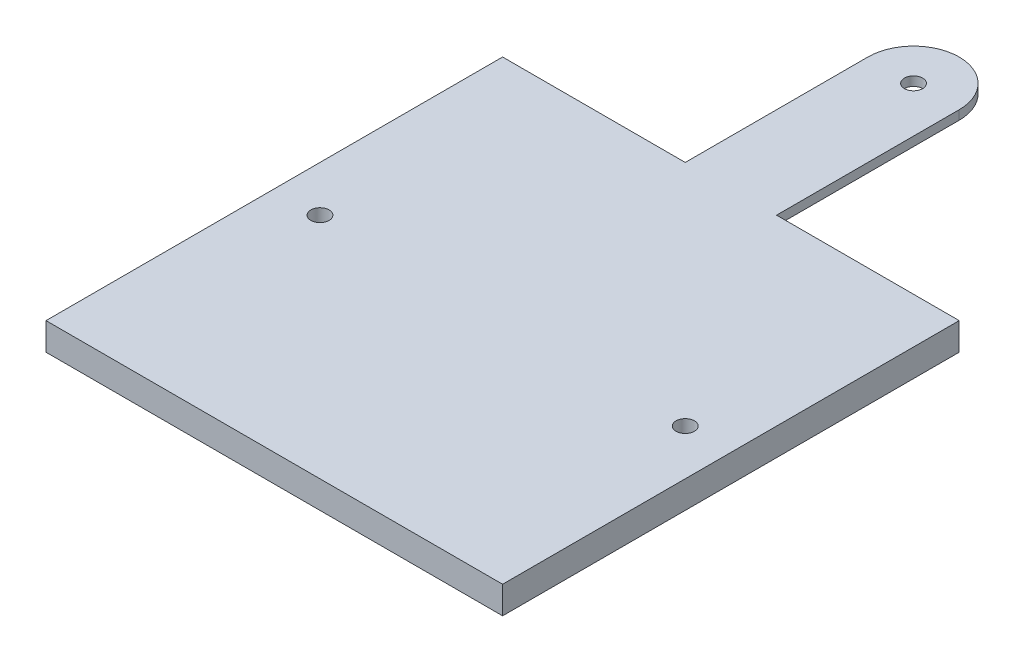
ISO-10303-21;
HEADER;
FILE_DESCRIPTION(('STEP AP214'),'2;1');
FILE_NAME('part.step','',(''),(''),'','','');
FILE_SCHEMA(('AUTOMOTIVE_DESIGN { 1 0 10303 214 1 1 1 1 }'));
ENDSEC;
DATA;
#1=APPLICATION_CONTEXT('core data for automotive mechanical design processes');
#2=APPLICATION_PROTOCOL_DEFINITION('international standard','automotive_design',2000,#1);
#3=PRODUCT_CONTEXT('',#1,'mechanical');
#4=PRODUCT('Part','Part','',(#3));
#5=PRODUCT_RELATED_PRODUCT_CATEGORY('part','',(#4));
#6=PRODUCT_DEFINITION_FORMATION('','',#4);
#7=PRODUCT_DEFINITION_CONTEXT('part definition',#1,'design');
#8=PRODUCT_DEFINITION('design','',#6,#7);
#9=PRODUCT_DEFINITION_SHAPE('','',#8);
#10=(LENGTH_UNIT() NAMED_UNIT(*) SI_UNIT(.MILLI.,.METRE.));
#11=(NAMED_UNIT(*) PLANE_ANGLE_UNIT() SI_UNIT($,.RADIAN.));
#12=(NAMED_UNIT(*) SI_UNIT($,.STERADIAN.) SOLID_ANGLE_UNIT());
#13=UNCERTAINTY_MEASURE_WITH_UNIT(LENGTH_MEASURE(1.E-05),#10,'distance_accuracy_value','');
#14=(GEOMETRIC_REPRESENTATION_CONTEXT(3) GLOBAL_UNCERTAINTY_ASSIGNED_CONTEXT((#13)) GLOBAL_UNIT_ASSIGNED_CONTEXT((#10,
#11,#12)) REPRESENTATION_CONTEXT('',''));
#15=CARTESIAN_POINT('',(0.,0.,0.));
#16=DIRECTION('',(0.,0.,1.));
#17=DIRECTION('',(1.,0.,0.));
#18=AXIS2_PLACEMENT_3D('',#15,#16,#17);
#19=CARTESIAN_POINT('',(0.,0.,0.));
#20=DIRECTION('',(0.,1.,0.));
#21=DIRECTION('',(0.,0.,1.));
#22=AXIS2_PLACEMENT_3D('',#19,#20,#21);
#23=PLANE('',#22);
#24=CARTESIAN_POINT('',(0.,0.,0.));
#25=DIRECTION('',(0.,1.,0.));
#26=DIRECTION('',(0.,0.,1.));
#27=AXIS2_PLACEMENT_3D('',#24,#25,#26);
#28=CIRCLE('',#27,10.);
#29=CARTESIAN_POINT('',(0.,0.,10.));
#30=VERTEX_POINT('',#29);
#31=EDGE_CURVE('E213',#30,#30,#28,.T.);
#32=ORIENTED_EDGE('',*,*,#31,.T.);
#33=EDGE_LOOP('',(#32));
#34=FACE_BOUND('',#33,.T.);
#35=DIRECTION('',(1.,0.,0.));
#36=VECTOR('',#35,1.);
#37=CARTESIAN_POINT('',(-250.,0.,200.));
#38=LINE('',#37,#36);
#39=CARTESIAN_POINT('',(-50.,0.,200.));
#40=VERTEX_POINT('',#39);
#41=CARTESIAN_POINT('',(50.,0.,200.));
#42=VERTEX_POINT('',#41);
#43=EDGE_CURVE('E11',#40,#42,#38,.T.);
#44=ORIENTED_EDGE('',*,*,#43,.F.);
#45=DIRECTION('',(0.,0.,1.));
#46=VECTOR('',#45,1.);
#47=CARTESIAN_POINT('',(-50.,0.,0.));
#48=LINE('',#47,#46);
#49=CARTESIAN_POINT('',(-50.,0.,0.));
#50=VERTEX_POINT('',#49);
#51=EDGE_CURVE('E144',#50,#40,#48,.T.);
#52=ORIENTED_EDGE('',*,*,#51,.F.);
#53=CARTESIAN_POINT('',(0.,0.,0.));
#54=DIRECTION('',(0.,1.,0.));
#55=DIRECTION('',(0.,0.,1.));
#56=AXIS2_PLACEMENT_3D('',#53,#54,#55);
#57=CIRCLE('',#56,50.);
#58=CARTESIAN_POINT('',(50.,0.,0.));
#59=VERTEX_POINT('',#58);
#60=EDGE_CURVE('E140',#59,#50,#57,.T.);
#61=ORIENTED_EDGE('',*,*,#60,.F.);
#62=DIRECTION('',(0.,0.,-1.));
#63=VECTOR('',#62,1.);
#64=CARTESIAN_POINT('',(50.,0.,0.));
#65=LINE('',#64,#63);
#66=EDGE_CURVE('E82',#42,#59,#65,.T.);
#67=ORIENTED_EDGE('',*,*,#66,.F.);
#68=EDGE_LOOP('',(#44,#52,#61,#67));
#69=FACE_BOUND('',#68,.T.);
#70=ADVANCED_FACE('F44',(#34,#69),#23,.F.);
#71=CARTESIAN_POINT('',(0.,10.,0.));
#72=DIRECTION('',(0.,1.,0.));
#73=DIRECTION('',(0.,0.,1.));
#74=AXIS2_PLACEMENT_3D('',#71,#72,#73);
#75=PLANE('',#74);
#76=CARTESIAN_POINT('',(200.,10.,450.));
#77=DIRECTION('',(0.,1.,0.));
#78=DIRECTION('',(0.,0.,1.));
#79=AXIS2_PLACEMENT_3D('',#76,#77,#78);
#80=CIRCLE('',#79,10.);
#81=CARTESIAN_POINT('',(200.,10.,460.));
#82=VERTEX_POINT('',#81);
#83=EDGE_CURVE('E204',#82,#82,#80,.T.);
#84=ORIENTED_EDGE('',*,*,#83,.F.);
#85=EDGE_LOOP('',(#84));
#86=FACE_BOUND('',#85,.T.);
#87=CARTESIAN_POINT('',(-200.,10.,450.));
#88=DIRECTION('',(0.,1.,0.));
#89=DIRECTION('',(0.,0.,-1.));
#90=AXIS2_PLACEMENT_3D('',#87,#88,#89);
#91=CIRCLE('',#90,10.);
#92=CARTESIAN_POINT('',(-200.,10.,440.));
#93=VERTEX_POINT('',#92);
#94=EDGE_CURVE('E366',#93,#93,#91,.T.);
#95=ORIENTED_EDGE('',*,*,#94,.F.);
#96=EDGE_LOOP('',(#95));
#97=FACE_BOUND('',#96,.T.);
#98=CARTESIAN_POINT('',(0.,10.,0.));
#99=DIRECTION('',(0.,1.,0.));
#100=DIRECTION('',(0.,0.,1.));
#101=AXIS2_PLACEMENT_3D('',#98,#99,#100);
#102=CIRCLE('',#101,50.);
#103=CARTESIAN_POINT('',(50.,10.,0.));
#104=VERTEX_POINT('',#103);
#105=CARTESIAN_POINT('',(-50.,10.,0.));
#106=VERTEX_POINT('',#105);
#107=EDGE_CURVE('E151',#104,#106,#102,.T.);
#108=ORIENTED_EDGE('',*,*,#107,.T.);
#109=DIRECTION('',(0.,0.,1.));
#110=VECTOR('',#109,1.);
#111=CARTESIAN_POINT('',(-50.,10.,0.));
#112=LINE('',#111,#110);
#113=CARTESIAN_POINT('',(-50.,10.,200.));
#114=VERTEX_POINT('',#113);
#115=EDGE_CURVE('E91',#106,#114,#112,.T.);
#116=ORIENTED_EDGE('',*,*,#115,.T.);
#117=DIRECTION('',(-1.,0.,0.));
#118=VECTOR('',#117,1.);
#119=CARTESIAN_POINT('',(-250.,10.,200.));
#120=LINE('',#119,#118);
#121=CARTESIAN_POINT('',(-250.,10.,200.));
#122=VERTEX_POINT('',#121);
#123=EDGE_CURVE('E225',#114,#122,#120,.T.);
#124=ORIENTED_EDGE('',*,*,#123,.T.);
#125=DIRECTION('',(0.,0.,1.));
#126=VECTOR('',#125,1.);
#127=CARTESIAN_POINT('',(-250.,10.,700.));
#128=LINE('',#127,#126);
#129=CARTESIAN_POINT('',(-250.,10.,700.));
#130=VERTEX_POINT('',#129);
#131=EDGE_CURVE('E192',#122,#130,#128,.T.);
#132=ORIENTED_EDGE('',*,*,#131,.T.);
#133=DIRECTION('',(1.,0.,0.));
#134=VECTOR('',#133,1.);
#135=CARTESIAN_POINT('',(250.,10.,700.));
#136=LINE('',#135,#134);
#137=CARTESIAN_POINT('',(250.,10.,700.));
#138=VERTEX_POINT('',#137);
#139=EDGE_CURVE('E113',#130,#138,#136,.T.);
#140=ORIENTED_EDGE('',*,*,#139,.T.);
#141=DIRECTION('',(0.,0.,-1.));
#142=VECTOR('',#141,1.);
#143=CARTESIAN_POINT('',(250.,10.,200.));
#144=LINE('',#143,#142);
#145=CARTESIAN_POINT('',(250.,10.,200.));
#146=VERTEX_POINT('',#145);
#147=EDGE_CURVE('E106',#138,#146,#144,.T.);
#148=ORIENTED_EDGE('',*,*,#147,.T.);
#149=DIRECTION('',(-1.,0.,0.));
#150=VECTOR('',#149,1.);
#151=CARTESIAN_POINT('',(50.,10.,200.));
#152=LINE('',#151,#150);
#153=CARTESIAN_POINT('',(50.,10.,200.));
#154=VERTEX_POINT('',#153);
#155=EDGE_CURVE('E111',#146,#154,#152,.T.);
#156=ORIENTED_EDGE('',*,*,#155,.T.);
#157=DIRECTION('',(0.,0.,-1.));
#158=VECTOR('',#157,1.);
#159=CARTESIAN_POINT('',(50.,10.,0.));
#160=LINE('',#159,#158);
#161=EDGE_CURVE('E63',#154,#104,#160,.T.);
#162=ORIENTED_EDGE('',*,*,#161,.T.);
#163=EDGE_LOOP('',(#108,#116,#124,#132,#140,#148,#156,#162));
#164=FACE_BOUND('',#163,.T.);
#165=CARTESIAN_POINT('',(0.,10.,0.));
#166=DIRECTION('',(0.,1.,0.));
#167=DIRECTION('',(0.,0.,1.));
#168=AXIS2_PLACEMENT_3D('',#165,#166,#167);
#169=CIRCLE('',#168,10.);
#170=CARTESIAN_POINT('',(0.,10.,10.));
#171=VERTEX_POINT('',#170);
#172=EDGE_CURVE('E145',#171,#171,#169,.T.);
#173=ORIENTED_EDGE('',*,*,#172,.F.);
#174=EDGE_LOOP('',(#173));
#175=FACE_BOUND('',#174,.T.);
#176=ADVANCED_FACE('F108',(#86,#97,#164,#175),#75,.T.);
#177=CARTESIAN_POINT('',(0.,10.,0.));
#178=DIRECTION('',(0.,-1.,0.));
#179=DIRECTION('',(0.,0.,-1.));
#180=AXIS2_PLACEMENT_3D('',#177,#178,#179);
#181=CYLINDRICAL_SURFACE('',#180,50.);
#182=ORIENTED_EDGE('',*,*,#60,.T.);
#183=DIRECTION('',(0.,-1.,0.));
#184=VECTOR('',#183,1.);
#185=CARTESIAN_POINT('',(-50.,10.,0.));
#186=LINE('',#185,#184);
#187=EDGE_CURVE('E48',#106,#50,#186,.T.);
#188=ORIENTED_EDGE('',*,*,#187,.F.);
#189=ORIENTED_EDGE('',*,*,#107,.F.);
#190=DIRECTION('',(0.,-1.,0.));
#191=VECTOR('',#190,1.);
#192=CARTESIAN_POINT('',(50.,10.,0.));
#193=LINE('',#192,#191);
#194=EDGE_CURVE('E136',#104,#59,#193,.T.);
#195=ORIENTED_EDGE('',*,*,#194,.T.);
#196=EDGE_LOOP('',(#182,#188,#189,#195));
#197=FACE_BOUND('',#196,.T.);
#198=ADVANCED_FACE('F46',(#197),#181,.T.);
#199=CARTESIAN_POINT('',(-50.,10.,0.));
#200=DIRECTION('',(1.,0.,0.));
#201=DIRECTION('',(0.,0.,-1.));
#202=AXIS2_PLACEMENT_3D('',#199,#200,#201);
#203=PLANE('',#202);
#204=ORIENTED_EDGE('',*,*,#51,.T.);
#205=DIRECTION('',(0.,-1.,0.));
#206=VECTOR('',#205,1.);
#207=CARTESIAN_POINT('',(-50.,10.,200.));
#208=LINE('',#207,#206);
#209=EDGE_CURVE('E165',#114,#40,#208,.T.);
#210=ORIENTED_EDGE('',*,*,#209,.F.);
#211=ORIENTED_EDGE('',*,*,#115,.F.);
#212=ORIENTED_EDGE('',*,*,#187,.T.);
#213=EDGE_LOOP('',(#204,#210,#211,#212));
#214=FACE_BOUND('',#213,.T.);
#215=ADVANCED_FACE('F170',(#214),#203,.F.);
#216=CARTESIAN_POINT('',(-250.,10.,700.));
#217=DIRECTION('',(1.,0.,0.));
#218=DIRECTION('',(0.,0.,-1.));
#219=AXIS2_PLACEMENT_3D('',#216,#217,#218);
#220=PLANE('',#219);
#221=DIRECTION('',(0.,-1.,0.));
#222=VECTOR('',#221,1.);
#223=CARTESIAN_POINT('',(-250.,10.,200.));
#224=LINE('',#223,#222);
#225=CARTESIAN_POINT('',(-250.,-20.,200.));
#226=VERTEX_POINT('',#225);
#227=EDGE_CURVE('E162',#122,#226,#224,.T.);
#228=ORIENTED_EDGE('',*,*,#227,.T.);
#229=DIRECTION('',(0.,0.,-1.));
#230=VECTOR('',#229,1.);
#231=CARTESIAN_POINT('',(-250.,-20.,700.));
#232=LINE('',#231,#230);
#233=CARTESIAN_POINT('',(-250.,-20.,700.));
#234=VERTEX_POINT('',#233);
#235=EDGE_CURVE('E191',#234,#226,#232,.T.);
#236=ORIENTED_EDGE('',*,*,#235,.F.);
#237=DIRECTION('',(0.,-1.,0.));
#238=VECTOR('',#237,1.);
#239=CARTESIAN_POINT('',(-250.,10.,700.));
#240=LINE('',#239,#238);
#241=EDGE_CURVE('E158',#130,#234,#240,.T.);
#242=ORIENTED_EDGE('',*,*,#241,.F.);
#243=ORIENTED_EDGE('',*,*,#131,.F.);
#244=EDGE_LOOP('',(#228,#236,#242,#243));
#245=FACE_BOUND('',#244,.T.);
#246=ADVANCED_FACE('F189',(#245),#220,.F.);
#247=CARTESIAN_POINT('',(250.,10.,700.));
#248=DIRECTION('',(0.,0.,-1.));
#249=DIRECTION('',(-1.,0.,0.));
#250=AXIS2_PLACEMENT_3D('',#247,#248,#249);
#251=PLANE('',#250);
#252=ORIENTED_EDGE('',*,*,#241,.T.);
#253=DIRECTION('',(-1.,0.,0.));
#254=VECTOR('',#253,1.);
#255=CARTESIAN_POINT('',(-250.,-20.,700.));
#256=LINE('',#255,#254);
#257=CARTESIAN_POINT('',(250.,-20.,700.));
#258=VERTEX_POINT('',#257);
#259=EDGE_CURVE('E198',#258,#234,#256,.T.);
#260=ORIENTED_EDGE('',*,*,#259,.F.);
#261=DIRECTION('',(0.,-1.,0.));
#262=VECTOR('',#261,1.);
#263=CARTESIAN_POINT('',(250.,10.,700.));
#264=LINE('',#263,#262);
#265=EDGE_CURVE('E129',#138,#258,#264,.T.);
#266=ORIENTED_EDGE('',*,*,#265,.F.);
#267=ORIENTED_EDGE('',*,*,#139,.F.);
#268=EDGE_LOOP('',(#252,#260,#266,#267));
#269=FACE_BOUND('',#268,.T.);
#270=ADVANCED_FACE('F230',(#269),#251,.F.);
#271=CARTESIAN_POINT('',(250.,10.,200.));
#272=DIRECTION('',(-1.,0.,0.));
#273=DIRECTION('',(0.,0.,1.));
#274=AXIS2_PLACEMENT_3D('',#271,#272,#273);
#275=PLANE('',#274);
#276=ORIENTED_EDGE('',*,*,#265,.T.);
#277=DIRECTION('',(0.,0.,1.));
#278=VECTOR('',#277,1.);
#279=CARTESIAN_POINT('',(250.,-20.,700.));
#280=LINE('',#279,#278);
#281=CARTESIAN_POINT('',(250.,-20.,200.));
#282=VERTEX_POINT('',#281);
#283=EDGE_CURVE('E125',#282,#258,#280,.T.);
#284=ORIENTED_EDGE('',*,*,#283,.F.);
#285=DIRECTION('',(0.,-1.,0.));
#286=VECTOR('',#285,1.);
#287=CARTESIAN_POINT('',(250.,10.,200.));
#288=LINE('',#287,#286);
#289=EDGE_CURVE('E121',#146,#282,#288,.T.);
#290=ORIENTED_EDGE('',*,*,#289,.F.);
#291=ORIENTED_EDGE('',*,*,#147,.F.);
#292=EDGE_LOOP('',(#276,#284,#290,#291));
#293=FACE_BOUND('',#292,.T.);
#294=ADVANCED_FACE('F122',(#293),#275,.F.);
#295=CARTESIAN_POINT('',(50.,10.,200.));
#296=DIRECTION('',(0.,0.,1.));
#297=DIRECTION('',(1.,0.,0.));
#298=AXIS2_PLACEMENT_3D('',#295,#296,#297);
#299=PLANE('',#298);
#300=ORIENTED_EDGE('',*,*,#289,.T.);
#301=DIRECTION('',(1.,0.,0.));
#302=VECTOR('',#301,1.);
#303=CARTESIAN_POINT('',(-250.,-20.,200.));
#304=LINE('',#303,#302);
#305=EDGE_CURVE('E193',#226,#282,#304,.T.);
#306=ORIENTED_EDGE('',*,*,#305,.F.);
#307=ORIENTED_EDGE('',*,*,#227,.F.);
#308=ORIENTED_EDGE('',*,*,#123,.F.);
#309=ORIENTED_EDGE('',*,*,#209,.T.);
#310=ORIENTED_EDGE('',*,*,#43,.T.);
#311=DIRECTION('',(0.,-1.,0.));
#312=VECTOR('',#311,1.);
#313=CARTESIAN_POINT('',(50.,10.,200.));
#314=LINE('',#313,#312);
#315=EDGE_CURVE('E130',#154,#42,#314,.T.);
#316=ORIENTED_EDGE('',*,*,#315,.F.);
#317=ORIENTED_EDGE('',*,*,#155,.F.);
#318=EDGE_LOOP('',(#300,#306,#307,#308,#309,#310,#316,#317));
#319=FACE_BOUND('',#318,.T.);
#320=ADVANCED_FACE('F132',(#319),#299,.F.);
#321=CARTESIAN_POINT('',(50.,10.,0.));
#322=DIRECTION('',(-1.,0.,0.));
#323=DIRECTION('',(0.,0.,1.));
#324=AXIS2_PLACEMENT_3D('',#321,#322,#323);
#325=PLANE('',#324);
#326=ORIENTED_EDGE('',*,*,#66,.T.);
#327=ORIENTED_EDGE('',*,*,#194,.F.);
#328=ORIENTED_EDGE('',*,*,#161,.F.);
#329=ORIENTED_EDGE('',*,*,#315,.T.);
#330=EDGE_LOOP('',(#326,#327,#328,#329));
#331=FACE_BOUND('',#330,.T.);
#332=ADVANCED_FACE('F251',(#331),#325,.F.);
#333=CARTESIAN_POINT('',(0.,10.,0.));
#334=DIRECTION('',(0.,-1.,0.));
#335=DIRECTION('',(0.,0.,-1.));
#336=AXIS2_PLACEMENT_3D('',#333,#334,#335);
#337=CYLINDRICAL_SURFACE('',#336,10.);
#338=ORIENTED_EDGE('',*,*,#172,.T.);
#339=EDGE_LOOP('',(#338));
#340=FACE_BOUND('',#339,.T.);
#341=ORIENTED_EDGE('',*,*,#31,.F.);
#342=EDGE_LOOP('',(#341));
#343=FACE_BOUND('',#342,.T.);
#344=ADVANCED_FACE('F254',(#340,#343),#337,.F.);
#345=CARTESIAN_POINT('',(0.,-20.,0.));
#346=DIRECTION('',(0.,-1.,0.));
#347=DIRECTION('',(0.,0.,-1.));
#348=AXIS2_PLACEMENT_3D('',#345,#346,#347);
#349=PLANE('',#348);
#350=CARTESIAN_POINT('',(200.,-20.,450.));
#351=DIRECTION('',(0.,1.,0.));
#352=DIRECTION('',(0.,0.,1.));
#353=AXIS2_PLACEMENT_3D('',#350,#351,#352);
#354=CIRCLE('',#353,10.);
#355=CARTESIAN_POINT('',(200.,-20.,460.));
#356=VERTEX_POINT('',#355);
#357=EDGE_CURVE('E200',#356,#356,#354,.T.);
#358=ORIENTED_EDGE('',*,*,#357,.T.);
#359=EDGE_LOOP('',(#358));
#360=FACE_BOUND('',#359,.T.);
#361=CARTESIAN_POINT('',(-200.,-20.,450.));
#362=DIRECTION('',(0.,1.,0.));
#363=DIRECTION('',(0.,0.,-1.));
#364=AXIS2_PLACEMENT_3D('',#361,#362,#363);
#365=CIRCLE('',#364,10.);
#366=CARTESIAN_POINT('',(-200.,-20.,440.));
#367=VERTEX_POINT('',#366);
#368=EDGE_CURVE('E207',#367,#367,#365,.T.);
#369=ORIENTED_EDGE('',*,*,#368,.T.);
#370=EDGE_LOOP('',(#369));
#371=FACE_BOUND('',#370,.T.);
#372=ORIENTED_EDGE('',*,*,#235,.T.);
#373=ORIENTED_EDGE('',*,*,#305,.T.);
#374=ORIENTED_EDGE('',*,*,#283,.T.);
#375=ORIENTED_EDGE('',*,*,#259,.T.);
#376=EDGE_LOOP('',(#372,#373,#374,#375));
#377=FACE_BOUND('',#376,.T.);
#378=ADVANCED_FACE('F197',(#360,#371,#377),#349,.T.);
#379=CARTESIAN_POINT('',(-200.,-20.,450.));
#380=DIRECTION('',(0.,1.,0.));
#381=DIRECTION('',(0.,0.,1.));
#382=AXIS2_PLACEMENT_3D('',#379,#380,#381);
#383=CYLINDRICAL_SURFACE('',#382,10.);
#384=ORIENTED_EDGE('',*,*,#368,.F.);
#385=EDGE_LOOP('',(#384));
#386=FACE_BOUND('',#385,.T.);
#387=ORIENTED_EDGE('',*,*,#94,.T.);
#388=EDGE_LOOP('',(#387));
#389=FACE_BOUND('',#388,.T.);
#390=ADVANCED_FACE('F280',(#386,#389),#383,.F.);
#391=CARTESIAN_POINT('',(200.,-20.,450.));
#392=DIRECTION('',(0.,1.,0.));
#393=DIRECTION('',(0.,0.,1.));
#394=AXIS2_PLACEMENT_3D('',#391,#392,#393);
#395=CYLINDRICAL_SURFACE('',#394,10.);
#396=ORIENTED_EDGE('',*,*,#357,.F.);
#397=EDGE_LOOP('',(#396));
#398=FACE_BOUND('',#397,.T.);
#399=ORIENTED_EDGE('',*,*,#83,.T.);
#400=EDGE_LOOP('',(#399));
#401=FACE_BOUND('',#400,.T.);
#402=ADVANCED_FACE('F289',(#398,#401),#395,.F.);
#403=CLOSED_SHELL('',(#70,#176,#198,#215,#246,#270,#294,#320,#332,#344,#378,#390,#402));
#404=MANIFOLD_SOLID_BREP('B2',#403);
#405=ADVANCED_BREP_SHAPE_REPRESENTATION('',(#18,#404),#14);
#406=SHAPE_DEFINITION_REPRESENTATION(#9,#405);
ENDSEC;
END-ISO-10303-21;
